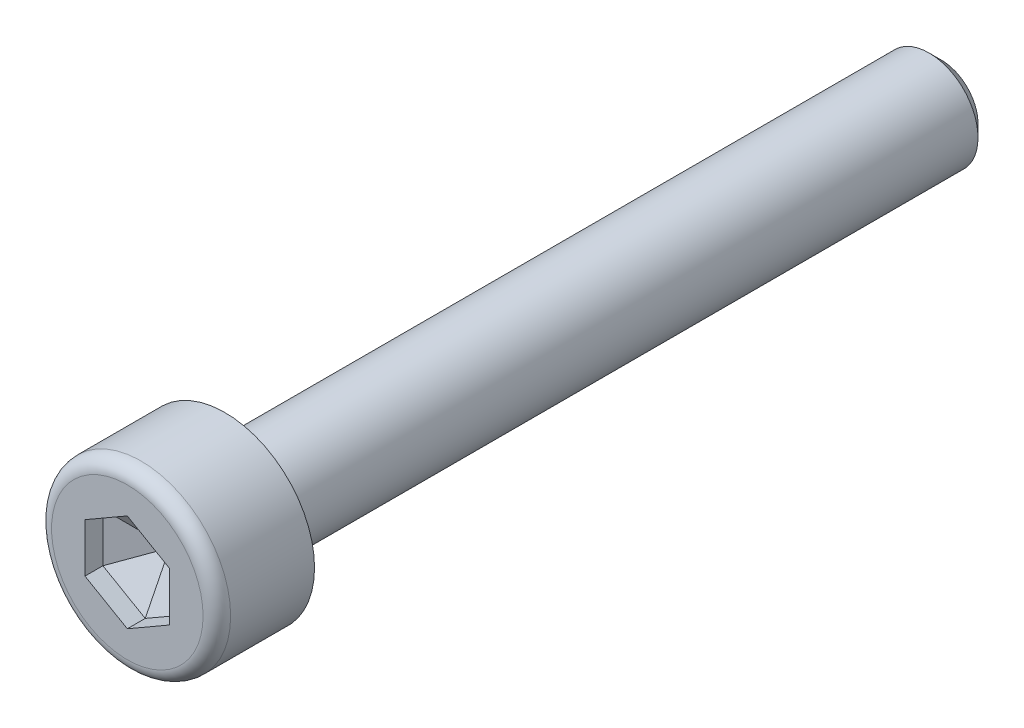
ISO-10303-21;
HEADER;
FILE_DESCRIPTION(('STEP AP214'),'2;1');
FILE_NAME('part.step','',(''),(''),'','','');
FILE_SCHEMA(('AUTOMOTIVE_DESIGN { 1 0 10303 214 1 1 1 1 }'));
ENDSEC;
DATA;
#1=APPLICATION_CONTEXT('core data for automotive mechanical design processes');
#2=APPLICATION_PROTOCOL_DEFINITION('international standard','automotive_design',2000,#1);
#3=PRODUCT_CONTEXT('',#1,'mechanical');
#4=PRODUCT('Part','Part','',(#3));
#5=PRODUCT_RELATED_PRODUCT_CATEGORY('part','',(#4));
#6=PRODUCT_DEFINITION_FORMATION('','',#4);
#7=PRODUCT_DEFINITION_CONTEXT('part definition',#1,'design');
#8=PRODUCT_DEFINITION('design','',#6,#7);
#9=PRODUCT_DEFINITION_SHAPE('','',#8);
#10=(LENGTH_UNIT() NAMED_UNIT(*) SI_UNIT(.MILLI.,.METRE.));
#11=(NAMED_UNIT(*) PLANE_ANGLE_UNIT() SI_UNIT($,.RADIAN.));
#12=(NAMED_UNIT(*) SI_UNIT($,.STERADIAN.) SOLID_ANGLE_UNIT());
#13=UNCERTAINTY_MEASURE_WITH_UNIT(LENGTH_MEASURE(1.E-05),#10,'distance_accuracy_value','');
#14=(GEOMETRIC_REPRESENTATION_CONTEXT(3) GLOBAL_UNCERTAINTY_ASSIGNED_CONTEXT((#13)) GLOBAL_UNIT_ASSIGNED_CONTEXT((#10,
#11,#12)) REPRESENTATION_CONTEXT('',''));
#15=CARTESIAN_POINT('',(0.,0.,0.));
#16=DIRECTION('',(0.,0.,1.));
#17=DIRECTION('',(1.,0.,0.));
#18=AXIS2_PLACEMENT_3D('',#15,#16,#17);
#19=CARTESIAN_POINT('',(0.,0.,0.));
#20=DIRECTION('',(0.,0.,1.));
#21=DIRECTION('',(1.,0.,0.));
#22=AXIS2_PLACEMENT_3D('',#19,#20,#21);
#23=PLANE('',#22);
#24=CARTESIAN_POINT('',(0.,0.,0.));
#25=DIRECTION('',(0.,0.,1.));
#26=DIRECTION('',(1.,0.,0.));
#27=AXIS2_PLACEMENT_3D('',#24,#25,#26);
#28=CIRCLE('',#27,1.6);
#29=CARTESIAN_POINT('',(1.6,0.,0.));
#30=VERTEX_POINT('',#29);
#31=EDGE_CURVE('E11',#30,#30,#28,.T.);
#32=ORIENTED_EDGE('',*,*,#31,.T.);
#33=EDGE_LOOP('',(#32));
#34=FACE_BOUND('',#33,.T.);
#35=CARTESIAN_POINT('',(0.,0.,0.));
#36=DIRECTION('',(0.,0.,1.));
#37=DIRECTION('',(1.,0.,0.));
#38=AXIS2_PLACEMENT_3D('',#35,#36,#37);
#39=CIRCLE('',#38,2.75);
#40=CARTESIAN_POINT('',(2.75,0.,0.));
#41=VERTEX_POINT('',#40);
#42=EDGE_CURVE('E154',#41,#41,#39,.T.);
#43=ORIENTED_EDGE('',*,*,#42,.F.);
#44=EDGE_LOOP('',(#43));
#45=FACE_BOUND('',#44,.T.);
#46=ADVANCED_FACE('F44',(#34,#45),#23,.F.);
#47=CARTESIAN_POINT('',(0.,0.,3.));
#48=DIRECTION('',(0.,0.,-1.));
#49=DIRECTION('',(-1.,0.,0.));
#50=AXIS2_PLACEMENT_3D('',#47,#48,#49);
#51=CYLINDRICAL_SURFACE('',#50,2.75);
#52=CARTESIAN_POINT('',(0.,0.,2.57692307692308));
#53=DIRECTION('',(0.,0.,1.));
#54=DIRECTION('',(1.,0.,0.));
#55=AXIS2_PLACEMENT_3D('',#52,#53,#54);
#56=CIRCLE('',#55,2.75);
#57=CARTESIAN_POINT('',(2.75,0.,2.57692307692308));
#58=VERTEX_POINT('',#57);
#59=EDGE_CURVE('E172',#58,#58,#56,.F.);
#60=ORIENTED_EDGE('',*,*,#59,.T.);
#61=EDGE_LOOP('',(#60));
#62=FACE_BOUND('',#61,.T.);
#63=ORIENTED_EDGE('',*,*,#42,.T.);
#64=EDGE_LOOP('',(#63));
#65=FACE_BOUND('',#64,.T.);
#66=ADVANCED_FACE('F231',(#62,#65),#51,.T.);
#67=CARTESIAN_POINT('',(0.,0.,3.));
#68=DIRECTION('',(0.,0.,1.));
#69=DIRECTION('',(1.,0.,0.));
#70=AXIS2_PLACEMENT_3D('',#67,#68,#69);
#71=PLANE('',#70);
#72=CARTESIAN_POINT('',(0.,0.,3.));
#73=DIRECTION('',(0.,0.,1.));
#74=DIRECTION('',(1.,0.,0.));
#75=AXIS2_PLACEMENT_3D('',#72,#73,#74);
#76=CIRCLE('',#75,2.32692307692308);
#77=CARTESIAN_POINT('',(2.32692307692308,0.,3.));
#78=VERTEX_POINT('',#77);
#79=EDGE_CURVE('E169',#78,#78,#76,.T.);
#80=ORIENTED_EDGE('',*,*,#79,.T.);
#81=EDGE_LOOP('',(#80));
#82=FACE_BOUND('',#81,.T.);
#83=DIRECTION('',(0.,1.,0.));
#84=VECTOR('',#83,1.);
#85=CARTESIAN_POINT('',(1.3,-0.750555349946514,3.));
#86=LINE('',#85,#84);
#87=CARTESIAN_POINT('',(1.3,-0.750555349946514,3.));
#88=VERTEX_POINT('',#87);
#89=CARTESIAN_POINT('',(1.3,0.750555349946514,3.));
#90=VERTEX_POINT('',#89);
#91=EDGE_CURVE('E136',#88,#90,#86,.T.);
#92=ORIENTED_EDGE('',*,*,#91,.F.);
#93=DIRECTION('',(0.866025403784439,0.5,0.));
#94=VECTOR('',#93,1.);
#95=CARTESIAN_POINT('',(0.,-1.50111069989303,3.));
#96=LINE('',#95,#94);
#97=CARTESIAN_POINT('',(0.,-1.50111069989303,3.));
#98=VERTEX_POINT('',#97);
#99=EDGE_CURVE('E149',#98,#88,#96,.T.);
#100=ORIENTED_EDGE('',*,*,#99,.F.);
#101=DIRECTION('',(0.866025403784439,-0.5,0.));
#102=VECTOR('',#101,1.);
#103=CARTESIAN_POINT('',(-1.3,-0.750555349946513,3.));
#104=LINE('',#103,#102);
#105=CARTESIAN_POINT('',(-1.3,-0.750555349946513,3.));
#106=VERTEX_POINT('',#105);
#107=EDGE_CURVE('E143',#106,#98,#104,.T.);
#108=ORIENTED_EDGE('',*,*,#107,.F.);
#109=DIRECTION('',(0.,-1.,0.));
#110=VECTOR('',#109,1.);
#111=CARTESIAN_POINT('',(-1.3,0.750555349946514,3.));
#112=LINE('',#111,#110);
#113=CARTESIAN_POINT('',(-1.3,0.750555349946514,3.));
#114=VERTEX_POINT('',#113);
#115=EDGE_CURVE('E141',#114,#106,#112,.T.);
#116=ORIENTED_EDGE('',*,*,#115,.F.);
#117=DIRECTION('',(-0.866025403784439,-0.5,0.));
#118=VECTOR('',#117,1.);
#119=CARTESIAN_POINT('',(0.,1.50111069989303,3.));
#120=LINE('',#119,#118);
#121=CARTESIAN_POINT('',(0.,1.50111069989303,3.));
#122=VERTEX_POINT('',#121);
#123=EDGE_CURVE('E121',#122,#114,#120,.T.);
#124=ORIENTED_EDGE('',*,*,#123,.F.);
#125=DIRECTION('',(-0.866025403784439,0.5,0.));
#126=VECTOR('',#125,1.);
#127=CARTESIAN_POINT('',(1.3,0.750555349946514,3.));
#128=LINE('',#127,#126);
#129=EDGE_CURVE('E131',#90,#122,#128,.T.);
#130=ORIENTED_EDGE('',*,*,#129,.F.);
#131=EDGE_LOOP('',(#92,#100,#108,#116,#124,#130));
#132=FACE_BOUND('',#131,.T.);
#133=ADVANCED_FACE('F138',(#82,#132),#71,.T.);
#134=CARTESIAN_POINT('',(1.3,-0.750555349946514,1.7));
#135=DIRECTION('',(1.,0.,0.));
#136=DIRECTION('',(0.,1.,0.));
#137=AXIS2_PLACEMENT_3D('',#134,#135,#136);
#138=PLANE('',#137);
#139=DIRECTION('',(0.,0.,1.));
#140=VECTOR('',#139,1.);
#141=CARTESIAN_POINT('',(1.3,0.750555349946514,1.7));
#142=LINE('',#141,#140);
#143=CARTESIAN_POINT('',(1.3,0.750555349946514,2.4492795389049));
#144=VERTEX_POINT('',#143);
#145=EDGE_CURVE('E128',#144,#90,#142,.T.);
#146=ORIENTED_EDGE('',*,*,#145,.F.);
#147=DIRECTION('',(0.,-1.,0.));
#148=VECTOR('',#147,1.);
#149=CARTESIAN_POINT('',(1.3,-0.750555349946514,2.4492795389049));
#150=LINE('',#149,#148);
#151=CARTESIAN_POINT('',(1.3,-0.750555349946514,2.4492795389049));
#152=VERTEX_POINT('',#151);
#153=EDGE_CURVE('E67',#144,#152,#150,.T.);
#154=ORIENTED_EDGE('',*,*,#153,.T.);
#155=DIRECTION('',(0.,0.,1.));
#156=VECTOR('',#155,1.);
#157=CARTESIAN_POINT('',(1.3,-0.750555349946514,1.7));
#158=LINE('',#157,#156);
#159=EDGE_CURVE('E152',#152,#88,#158,.T.);
#160=ORIENTED_EDGE('',*,*,#159,.T.);
#161=ORIENTED_EDGE('',*,*,#91,.T.);
#162=EDGE_LOOP('',(#146,#154,#160,#161));
#163=FACE_BOUND('',#162,.T.);
#164=ADVANCED_FACE('F291',(#163),#138,.F.);
#165=CARTESIAN_POINT('',(0.,-1.50111069989303,1.7));
#166=DIRECTION('',(0.5,-0.866025403784439,0.));
#167=DIRECTION('',(0.866025403784439,0.5,0.));
#168=AXIS2_PLACEMENT_3D('',#165,#166,#167);
#169=PLANE('',#168);
#170=ORIENTED_EDGE('',*,*,#159,.F.);
#171=DIRECTION('',(-0.866025403784439,-0.5,0.));
#172=VECTOR('',#171,1.);
#173=CARTESIAN_POINT('',(0.,-1.50111069989303,2.4492795389049));
#174=LINE('',#173,#172);
#175=CARTESIAN_POINT('',(0.,-1.50111069989303,2.4492795389049));
#176=VERTEX_POINT('',#175);
#177=EDGE_CURVE('E59',#152,#176,#174,.T.);
#178=ORIENTED_EDGE('',*,*,#177,.T.);
#179=DIRECTION('',(0.,0.,1.));
#180=VECTOR('',#179,1.);
#181=CARTESIAN_POINT('',(0.,-1.50111069989303,1.7));
#182=LINE('',#181,#180);
#183=EDGE_CURVE('E155',#176,#98,#182,.T.);
#184=ORIENTED_EDGE('',*,*,#183,.T.);
#185=ORIENTED_EDGE('',*,*,#99,.T.);
#186=EDGE_LOOP('',(#170,#178,#184,#185));
#187=FACE_BOUND('',#186,.T.);
#188=ADVANCED_FACE('F293',(#187),#169,.F.);
#189=CARTESIAN_POINT('',(-1.3,-0.750555349946513,1.7));
#190=DIRECTION('',(-0.5,-0.866025403784439,0.));
#191=DIRECTION('',(0.866025403784439,-0.5,0.));
#192=AXIS2_PLACEMENT_3D('',#189,#190,#191);
#193=PLANE('',#192);
#194=ORIENTED_EDGE('',*,*,#183,.F.);
#195=DIRECTION('',(-0.866025403784439,0.5,0.));
#196=VECTOR('',#195,1.);
#197=CARTESIAN_POINT('',(-1.3,-0.750555349946513,2.4492795389049));
#198=LINE('',#197,#196);
#199=CARTESIAN_POINT('',(-1.3,-0.750555349946513,2.4492795389049));
#200=VERTEX_POINT('',#199);
#201=EDGE_CURVE('E195',#176,#200,#198,.T.);
#202=ORIENTED_EDGE('',*,*,#201,.T.);
#203=DIRECTION('',(0.,0.,1.));
#204=VECTOR('',#203,1.);
#205=CARTESIAN_POINT('',(-1.3,-0.750555349946513,1.7));
#206=LINE('',#205,#204);
#207=EDGE_CURVE('E157',#200,#106,#206,.T.);
#208=ORIENTED_EDGE('',*,*,#207,.T.);
#209=ORIENTED_EDGE('',*,*,#107,.T.);
#210=EDGE_LOOP('',(#194,#202,#208,#209));
#211=FACE_BOUND('',#210,.T.);
#212=ADVANCED_FACE('F282',(#211),#193,.F.);
#213=CARTESIAN_POINT('',(-1.3,0.750555349946514,1.7));
#214=DIRECTION('',(-1.,0.,0.));
#215=DIRECTION('',(0.,0.,1.));
#216=AXIS2_PLACEMENT_3D('',#213,#214,#215);
#217=PLANE('',#216);
#218=ORIENTED_EDGE('',*,*,#207,.F.);
#219=DIRECTION('',(0.,1.,0.));
#220=VECTOR('',#219,1.);
#221=CARTESIAN_POINT('',(-1.3,0.750555349946514,2.4492795389049));
#222=LINE('',#221,#220);
#223=CARTESIAN_POINT('',(-1.3,0.750555349946514,2.4492795389049));
#224=VERTEX_POINT('',#223);
#225=EDGE_CURVE('E188',#200,#224,#222,.T.);
#226=ORIENTED_EDGE('',*,*,#225,.T.);
#227=DIRECTION('',(0.,0.,1.));
#228=VECTOR('',#227,1.);
#229=CARTESIAN_POINT('',(-1.3,0.750555349946514,1.7));
#230=LINE('',#229,#228);
#231=EDGE_CURVE('E127',#224,#114,#230,.T.);
#232=ORIENTED_EDGE('',*,*,#231,.T.);
#233=ORIENTED_EDGE('',*,*,#115,.T.);
#234=EDGE_LOOP('',(#218,#226,#232,#233));
#235=FACE_BOUND('',#234,.T.);
#236=ADVANCED_FACE('F285',(#235),#217,.F.);
#237=CARTESIAN_POINT('',(0.,1.50111069989303,1.7));
#238=DIRECTION('',(-0.5,0.866025403784439,0.));
#239=DIRECTION('',(-0.866025403784439,-0.5,0.));
#240=AXIS2_PLACEMENT_3D('',#237,#238,#239);
#241=PLANE('',#240);
#242=ORIENTED_EDGE('',*,*,#231,.F.);
#243=DIRECTION('',(0.866025403784439,0.5,0.));
#244=VECTOR('',#243,1.);
#245=CARTESIAN_POINT('',(0.,1.50111069989303,2.4492795389049));
#246=LINE('',#245,#244);
#247=CARTESIAN_POINT('',(0.,1.50111069989303,2.4492795389049));
#248=VERTEX_POINT('',#247);
#249=EDGE_CURVE('E124',#224,#248,#246,.T.);
#250=ORIENTED_EDGE('',*,*,#249,.T.);
#251=DIRECTION('',(0.,0.,1.));
#252=VECTOR('',#251,1.);
#253=CARTESIAN_POINT('',(0.,1.50111069989303,1.7));
#254=LINE('',#253,#252);
#255=EDGE_CURVE('E116',#248,#122,#254,.T.);
#256=ORIENTED_EDGE('',*,*,#255,.T.);
#257=ORIENTED_EDGE('',*,*,#123,.T.);
#258=EDGE_LOOP('',(#242,#250,#256,#257));
#259=FACE_BOUND('',#258,.T.);
#260=ADVANCED_FACE('F119',(#259),#241,.F.);
#261=CARTESIAN_POINT('',(1.3,0.750555349946514,1.7));
#262=DIRECTION('',(0.5,0.866025403784439,0.));
#263=DIRECTION('',(-0.866025403784439,0.5,0.));
#264=AXIS2_PLACEMENT_3D('',#261,#262,#263);
#265=PLANE('',#264);
#266=ORIENTED_EDGE('',*,*,#255,.F.);
#267=DIRECTION('',(0.866025403784439,-0.5,0.));
#268=VECTOR('',#267,1.);
#269=CARTESIAN_POINT('',(1.3,0.750555349946514,2.4492795389049));
#270=LINE('',#269,#268);
#271=EDGE_CURVE('E192',#248,#144,#270,.T.);
#272=ORIENTED_EDGE('',*,*,#271,.T.);
#273=ORIENTED_EDGE('',*,*,#145,.T.);
#274=ORIENTED_EDGE('',*,*,#129,.T.);
#275=EDGE_LOOP('',(#266,#272,#273,#274));
#276=FACE_BOUND('',#275,.T.);
#277=ADVANCED_FACE('F132',(#276),#265,.F.);
#278=CARTESIAN_POINT('',(0.,0.,1.7));
#279=DIRECTION('',(0.,0.,1.));
#280=DIRECTION('',(1.,0.,0.));
#281=AXIS2_PLACEMENT_3D('',#278,#279,#280);
#282=PLANE('',#281);
#283=DIRECTION('',(-0.866025403784439,-0.5,0.));
#284=VECTOR('',#283,1.);
#285=CARTESIAN_POINT('',(-0.00110488477245908,0.00191371656240831,1.7));
#286=LINE('',#285,#284);
#287=CARTESIAN_POINT('',(0.,0.00255162208321077,1.7));
#288=VERTEX_POINT('',#287);
#289=CARTESIAN_POINT('',(-0.00220976954491822,0.00127581104160551,1.7));
#290=VERTEX_POINT('',#289);
#291=EDGE_CURVE('E183',#288,#290,#286,.T.);
#292=ORIENTED_EDGE('',*,*,#291,.T.);
#293=DIRECTION('',(0.,-1.,0.));
#294=VECTOR('',#293,1.);
#295=CARTESIAN_POINT('',(-0.00220976954491822,0.,1.7));
#296=LINE('',#295,#294);
#297=CARTESIAN_POINT('',(-0.00220976954491822,-0.00127581104160539,1.7));
#298=VERTEX_POINT('',#297);
#299=EDGE_CURVE('E185',#290,#298,#296,.T.);
#300=ORIENTED_EDGE('',*,*,#299,.T.);
#301=DIRECTION('',(0.866025403784439,-0.5,0.));
#302=VECTOR('',#301,1.);
#303=CARTESIAN_POINT('',(-0.00110488477245903,-0.00191371656240821,1.7));
#304=LINE('',#303,#302);
#305=CARTESIAN_POINT('',(0.,-0.00255162208321082,1.7));
#306=VERTEX_POINT('',#305);
#307=EDGE_CURVE('E177',#298,#306,#304,.T.);
#308=ORIENTED_EDGE('',*,*,#307,.T.);
#309=DIRECTION('',(0.866025403784439,0.5,0.));
#310=VECTOR('',#309,1.);
#311=CARTESIAN_POINT('',(0.00110488477245889,-0.00191371656240798,1.7));
#312=LINE('',#311,#310);
#313=CARTESIAN_POINT('',(0.00220976954491811,-0.0012758110416051,1.7));
#314=VERTEX_POINT('',#313);
#315=EDGE_CURVE('E175',#306,#314,#312,.T.);
#316=ORIENTED_EDGE('',*,*,#315,.T.);
#317=DIRECTION('',(0.,1.,0.));
#318=VECTOR('',#317,1.);
#319=CARTESIAN_POINT('',(0.00220976954491811,0.,1.7));
#320=LINE('',#319,#318);
#321=CARTESIAN_POINT('',(0.00220976954491811,0.00127581104160497,1.7));
#322=VERTEX_POINT('',#321);
#323=EDGE_CURVE('E179',#314,#322,#320,.T.);
#324=ORIENTED_EDGE('',*,*,#323,.T.);
#325=DIRECTION('',(-0.866025403784439,0.5,0.));
#326=VECTOR('',#325,1.);
#327=CARTESIAN_POINT('',(0.00110488477245884,0.00191371656240789,1.7));
#328=LINE('',#327,#326);
#329=EDGE_CURVE('E181',#322,#288,#328,.T.);
#330=ORIENTED_EDGE('',*,*,#329,.T.);
#331=EDGE_LOOP('',(#292,#300,#308,#316,#324,#330));
#332=FACE_BOUND('',#331,.T.);
#333=ADVANCED_FACE('F302',(#332),#282,.T.);
#334=CARTESIAN_POINT('',(0.,0.,-22.));
#335=DIRECTION('',(0.,0.,1.));
#336=DIRECTION('',(1.,0.,0.));
#337=AXIS2_PLACEMENT_3D('',#334,#335,#336);
#338=CYLINDRICAL_SURFACE('',#337,1.5);
#339=CARTESIAN_POINT('',(0.,0.,-0.0999999999999994));
#340=DIRECTION('',(0.,0.,1.));
#341=DIRECTION('',(1.,0.,0.));
#342=AXIS2_PLACEMENT_3D('',#339,#340,#341);
#343=CIRCLE('',#342,1.5);
#344=CARTESIAN_POINT('',(1.5,0.,-0.0999999999999994));
#345=VERTEX_POINT('',#344);
#346=EDGE_CURVE('E52',#345,#345,#343,.F.);
#347=ORIENTED_EDGE('',*,*,#346,.T.);
#348=EDGE_LOOP('',(#347));
#349=FACE_BOUND('',#348,.T.);
#350=CARTESIAN_POINT('',(0.,0.,-21.625));
#351=DIRECTION('',(0.,0.,-1.));
#352=DIRECTION('',(-1.,0.,0.));
#353=AXIS2_PLACEMENT_3D('',#350,#351,#352);
#354=CIRCLE('',#353,1.5);
#355=CARTESIAN_POINT('',(-1.5,0.,-21.625));
#356=VERTEX_POINT('',#355);
#357=EDGE_CURVE('E166',#356,#356,#354,.F.);
#358=ORIENTED_EDGE('',*,*,#357,.T.);
#359=EDGE_LOOP('',(#358));
#360=FACE_BOUND('',#359,.T.);
#361=ADVANCED_FACE('F216',(#349,#360),#338,.T.);
#362=CARTESIAN_POINT('',(0.,0.,-22.));
#363=DIRECTION('',(0.,0.,-1.));
#364=DIRECTION('',(-1.,0.,0.));
#365=AXIS2_PLACEMENT_3D('',#362,#363,#364);
#366=PLANE('',#365);
#367=CARTESIAN_POINT('',(0.,0.,-22.));
#368=DIRECTION('',(0.,0.,-1.));
#369=DIRECTION('',(-1.,0.,0.));
#370=AXIS2_PLACEMENT_3D('',#367,#368,#369);
#371=CIRCLE('',#370,1.125);
#372=CARTESIAN_POINT('',(-1.125,0.,-22.));
#373=VERTEX_POINT('',#372);
#374=EDGE_CURVE('E163',#373,#373,#371,.T.);
#375=ORIENTED_EDGE('',*,*,#374,.T.);
#376=EDGE_LOOP('',(#375));
#377=FACE_BOUND('',#376,.T.);
#378=ADVANCED_FACE('F247',(#377),#366,.T.);
#379=CARTESIAN_POINT('',(0.,0.,-22.));
#380=DIRECTION('',(0.,0.,1.));
#381=DIRECTION('',(1.,0.,0.));
#382=AXIS2_PLACEMENT_3D('',#379,#380,#381);
#383=CONICAL_SURFACE('',#382,1.125,0.785398163397442);
#384=ORIENTED_EDGE('',*,*,#357,.F.);
#385=EDGE_LOOP('',(#384));
#386=FACE_BOUND('',#385,.T.);
#387=ORIENTED_EDGE('',*,*,#374,.F.);
#388=EDGE_LOOP('',(#387));
#389=FACE_BOUND('',#388,.T.);
#390=ADVANCED_FACE('F243',(#386,#389),#383,.T.);
#391=CARTESIAN_POINT('',(0.,0.,2.57692307692308));
#392=DIRECTION('',(0.,0.,1.));
#393=DIRECTION('',(1.,0.,0.));
#394=AXIS2_PLACEMENT_3D('',#391,#392,#393);
#395=TOROIDAL_SURFACE('',#394,2.32692307692308,0.423076923076923);
#396=ORIENTED_EDGE('',*,*,#59,.F.);
#397=EDGE_LOOP('',(#396));
#398=FACE_BOUND('',#397,.T.);
#399=ORIENTED_EDGE('',*,*,#79,.F.);
#400=EDGE_LOOP('',(#399));
#401=FACE_BOUND('',#400,.T.);
#402=ADVANCED_FACE('F246',(#398,#401),#395,.T.);
#403=CARTESIAN_POINT('',(0.00220976954491811,0.,1.7));
#404=DIRECTION('',(0.499999999999995,0.,-0.866025403784441));
#405=DIRECTION('',(0.,1.,0.));
#406=AXIS2_PLACEMENT_3D('',#403,#404,#405);
#407=PLANE('',#406);
#408=DIRECTION('',(-0.774596669241485,0.447213595499959,-0.447213595499953));
#409=VECTOR('',#408,1.);
#410=CARTESIAN_POINT('',(0.00176781563593457,-0.0010206488332842,1.69974483779168));
#411=LINE('',#410,#409);
#412=EDGE_CURVE('E208',#152,#314,#411,.T.);
#413=ORIENTED_EDGE('',*,*,#412,.F.);
#414=ORIENTED_EDGE('',*,*,#153,.F.);
#415=DIRECTION('',(-0.774596669241485,-0.447213595499959,-0.447213595499953));
#416=VECTOR('',#415,1.);
#417=CARTESIAN_POINT('',(0.0017678156359344,0.00102064883328385,1.69974483779168));
#418=LINE('',#417,#416);
#419=EDGE_CURVE('E211',#322,#144,#418,.F.);
#420=ORIENTED_EDGE('',*,*,#419,.F.);
#421=ORIENTED_EDGE('',*,*,#323,.F.);
#422=EDGE_LOOP('',(#413,#414,#420,#421));
#423=FACE_BOUND('',#422,.T.);
#424=ADVANCED_FACE('F250',(#423),#407,.F.);
#425=CARTESIAN_POINT('',(0.00110488477245884,0.00191371656240789,1.7));
#426=DIRECTION('',(0.249999999999997,0.433012701892215,-0.866025403784441));
#427=DIRECTION('',(-0.866025403784439,0.5,0.));
#428=AXIS2_PLACEMENT_3D('',#425,#426,#427);
#429=PLANE('',#428);
#430=ORIENTED_EDGE('',*,*,#419,.T.);
#431=ORIENTED_EDGE('',*,*,#271,.F.);
#432=DIRECTION('',(0.,-0.894427190999918,-0.447213595499953));
#433=VECTOR('',#432,1.);
#434=CARTESIAN_POINT('',(0.,0.0020412976665688,1.69974483779168));
#435=LINE('',#434,#433);
#436=EDGE_CURVE('E205',#288,#248,#435,.F.);
#437=ORIENTED_EDGE('',*,*,#436,.F.);
#438=ORIENTED_EDGE('',*,*,#329,.F.);
#439=EDGE_LOOP('',(#430,#431,#437,#438));
#440=FACE_BOUND('',#439,.T.);
#441=ADVANCED_FACE('F263',(#440),#429,.F.);
#442=CARTESIAN_POINT('',(0.00110488477245895,-0.00191371656240807,1.7));
#443=DIRECTION('',(0.249999999999997,-0.433012701892215,-0.866025403784441));
#444=DIRECTION('',(0.866025403784439,0.5,0.));
#445=AXIS2_PLACEMENT_3D('',#442,#443,#444);
#446=PLANE('',#445);
#447=ORIENTED_EDGE('',*,*,#412,.T.);
#448=ORIENTED_EDGE('',*,*,#315,.F.);
#449=DIRECTION('',(0.,-0.894427190999918,0.447213595499953));
#450=VECTOR('',#449,1.);
#451=CARTESIAN_POINT('',(0.,-0.00204129766656878,1.69974483779168));
#452=LINE('',#451,#450);
#453=EDGE_CURVE('E202',#176,#306,#452,.F.);
#454=ORIENTED_EDGE('',*,*,#453,.F.);
#455=ORIENTED_EDGE('',*,*,#177,.F.);
#456=EDGE_LOOP('',(#447,#448,#454,#455));
#457=FACE_BOUND('',#456,.T.);
#458=ADVANCED_FACE('F259',(#457),#446,.F.);
#459=CARTESIAN_POINT('',(-0.00110488477245908,0.00191371656240831,1.7));
#460=DIRECTION('',(-0.249999999999997,0.433012701892215,-0.866025403784441));
#461=DIRECTION('',(-0.866025403784439,-0.5,0.));
#462=AXIS2_PLACEMENT_3D('',#459,#460,#461);
#463=PLANE('',#462);
#464=ORIENTED_EDGE('',*,*,#436,.T.);
#465=ORIENTED_EDGE('',*,*,#249,.F.);
#466=DIRECTION('',(0.774596669241485,-0.447213595499959,-0.447213595499953));
#467=VECTOR('',#466,1.);
#468=CARTESIAN_POINT('',(-0.00176781563593459,0.00102064883328441,1.69974483779168));
#469=LINE('',#468,#467);
#470=EDGE_CURVE('E200',#290,#224,#469,.F.);
#471=ORIENTED_EDGE('',*,*,#470,.F.);
#472=ORIENTED_EDGE('',*,*,#291,.F.);
#473=EDGE_LOOP('',(#464,#465,#471,#472));
#474=FACE_BOUND('',#473,.T.);
#475=ADVANCED_FACE('F255',(#474),#463,.F.);
#476=CARTESIAN_POINT('',(-0.00110488477245906,-0.00191371656240826,1.7));
#477=DIRECTION('',(-0.249999999999998,-0.433012701892215,-0.866025403784441));
#478=DIRECTION('',(0.866025403784439,-0.5,0.));
#479=AXIS2_PLACEMENT_3D('',#476,#477,#478);
#480=PLANE('',#479);
#481=ORIENTED_EDGE('',*,*,#453,.T.);
#482=ORIENTED_EDGE('',*,*,#307,.F.);
#483=DIRECTION('',(-0.774596669241485,-0.447213595499959,0.447213595499953));
#484=VECTOR('',#483,1.);
#485=CARTESIAN_POINT('',(-0.00176781563593462,-0.00102064883328435,1.69974483779168));
#486=LINE('',#485,#484);
#487=EDGE_CURVE('E198',#200,#298,#486,.F.);
#488=ORIENTED_EDGE('',*,*,#487,.F.);
#489=ORIENTED_EDGE('',*,*,#201,.F.);
#490=EDGE_LOOP('',(#481,#482,#488,#489));
#491=FACE_BOUND('',#490,.T.);
#492=ADVANCED_FACE('F226',(#491),#480,.F.);
#493=CARTESIAN_POINT('',(-0.00220976954491822,0.,1.7));
#494=DIRECTION('',(-0.499999999999995,0.,-0.866025403784441));
#495=DIRECTION('',(0.,-1.,0.));
#496=AXIS2_PLACEMENT_3D('',#493,#494,#495);
#497=PLANE('',#496);
#498=ORIENTED_EDGE('',*,*,#470,.T.);
#499=ORIENTED_EDGE('',*,*,#225,.F.);
#500=ORIENTED_EDGE('',*,*,#487,.T.);
#501=ORIENTED_EDGE('',*,*,#299,.F.);
#502=EDGE_LOOP('',(#498,#499,#500,#501));
#503=FACE_BOUND('',#502,.T.);
#504=ADVANCED_FACE('F220',(#503),#497,.F.);
#505=CARTESIAN_POINT('',(0.,0.,-0.0999999999999994));
#506=DIRECTION('',(0.,0.,1.));
#507=DIRECTION('',(1.,0.,0.));
#508=AXIS2_PLACEMENT_3D('',#505,#506,#507);
#509=TOROIDAL_SURFACE('',#508,1.6,0.1);
#510=ORIENTED_EDGE('',*,*,#31,.F.);
#511=EDGE_LOOP('',(#510));
#512=FACE_BOUND('',#511,.T.);
#513=ORIENTED_EDGE('',*,*,#346,.F.);
#514=EDGE_LOOP('',(#513));
#515=FACE_BOUND('',#514,.T.);
#516=ADVANCED_FACE('F46',(#512,#515),#509,.F.);
#517=CLOSED_SHELL('',(#46,#66,#133,#164,#188,#212,#236,#260,#277,#333,#361,#378,#390,#402,#424,
#441,#458,#475,#492,#504,#516));
#518=MANIFOLD_SOLID_BREP('B2',#517);
#519=ADVANCED_BREP_SHAPE_REPRESENTATION('',(#18,#518),#14);
#520=SHAPE_DEFINITION_REPRESENTATION(#9,#519);
ENDSEC;
END-ISO-10303-21;
